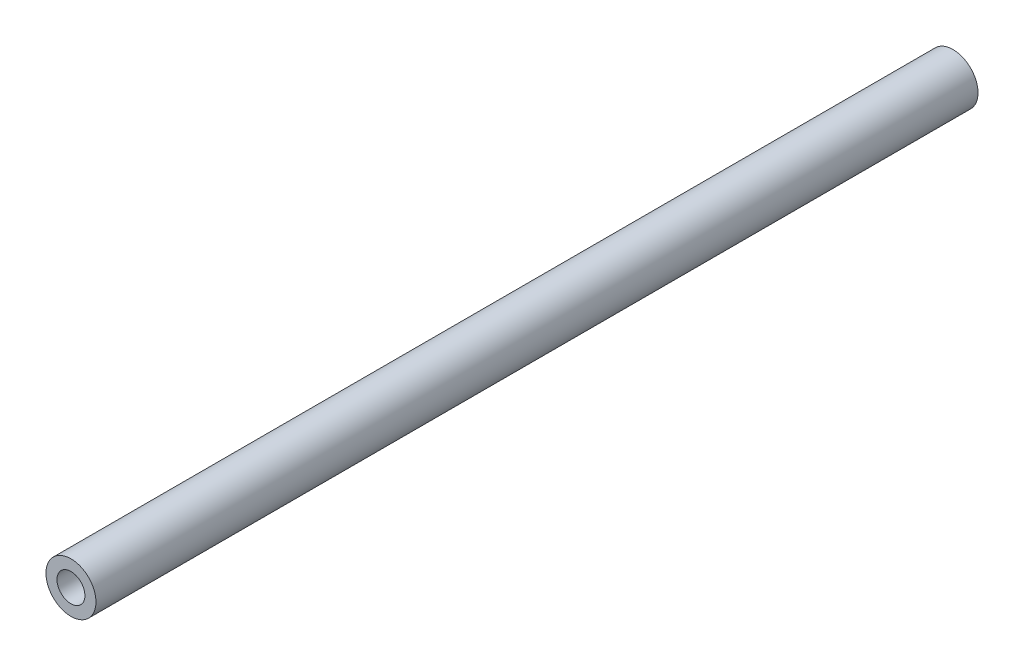
ISO-10303-21;
HEADER;
FILE_DESCRIPTION(('STEP AP214'),'2;1');
FILE_NAME('part.step','',(''),(''),'','','');
FILE_SCHEMA(('AUTOMOTIVE_DESIGN { 1 0 10303 214 1 1 1 1 }'));
ENDSEC;
DATA;
#1=APPLICATION_CONTEXT('core data for automotive mechanical design processes');
#2=APPLICATION_PROTOCOL_DEFINITION('international standard','automotive_design',2000,#1);
#3=PRODUCT_CONTEXT('',#1,'mechanical');
#4=PRODUCT('Part','Part','',(#3));
#5=PRODUCT_RELATED_PRODUCT_CATEGORY('part','',(#4));
#6=PRODUCT_DEFINITION_FORMATION('','',#4);
#7=PRODUCT_DEFINITION_CONTEXT('part definition',#1,'design');
#8=PRODUCT_DEFINITION('design','',#6,#7);
#9=PRODUCT_DEFINITION_SHAPE('','',#8);
#10=(LENGTH_UNIT() NAMED_UNIT(*) SI_UNIT(.MILLI.,.METRE.));
#11=(NAMED_UNIT(*) PLANE_ANGLE_UNIT() SI_UNIT($,.RADIAN.));
#12=(NAMED_UNIT(*) SI_UNIT($,.STERADIAN.) SOLID_ANGLE_UNIT());
#13=UNCERTAINTY_MEASURE_WITH_UNIT(LENGTH_MEASURE(1.E-05),#10,'distance_accuracy_value','');
#14=(GEOMETRIC_REPRESENTATION_CONTEXT(3) GLOBAL_UNCERTAINTY_ASSIGNED_CONTEXT((#13)) GLOBAL_UNIT_ASSIGNED_CONTEXT((#10,
#11,#12)) REPRESENTATION_CONTEXT('',''));
#15=CARTESIAN_POINT('',(0.,0.,0.));
#16=DIRECTION('',(0.,0.,1.));
#17=DIRECTION('',(1.,0.,0.));
#18=AXIS2_PLACEMENT_3D('',#15,#16,#17);
#19=CARTESIAN_POINT('',(0.,0.,300.));
#20=DIRECTION('',(0.,0.,1.));
#21=DIRECTION('',(1.,0.,0.));
#22=AXIS2_PLACEMENT_3D('',#19,#20,#21);
#23=PLANE('',#22);
#24=CARTESIAN_POINT('',(0.,0.,300.));
#25=DIRECTION('',(0.,0.,1.));
#26=DIRECTION('',(1.,0.,0.));
#27=AXIS2_PLACEMENT_3D('',#24,#25,#26);
#28=CIRCLE('',#27,8.5);
#29=CARTESIAN_POINT('',(8.5,0.,300.));
#30=VERTEX_POINT('',#29);
#31=EDGE_CURVE('E10',#30,#30,#28,.T.);
#32=ORIENTED_EDGE('',*,*,#31,.T.);
#33=EDGE_LOOP('',(#32));
#34=FACE_BOUND('',#33,.T.);
#35=CARTESIAN_POINT('',(0.,0.,300.));
#36=DIRECTION('',(0.,0.,1.));
#37=DIRECTION('',(1.,0.,0.));
#38=AXIS2_PLACEMENT_3D('',#35,#36,#37);
#39=CIRCLE('',#38,4.75);
#40=CARTESIAN_POINT('',(4.75,0.,300.));
#41=VERTEX_POINT('',#40);
#42=EDGE_CURVE('E50',#41,#41,#39,.T.);
#43=ORIENTED_EDGE('',*,*,#42,.F.);
#44=EDGE_LOOP('',(#43));
#45=FACE_BOUND('',#44,.T.);
#46=ADVANCED_FACE('F37',(#34,#45),#23,.T.);
#47=CARTESIAN_POINT('',(0.,0.,0.));
#48=DIRECTION('',(0.,0.,1.));
#49=DIRECTION('',(1.,0.,0.));
#50=AXIS2_PLACEMENT_3D('',#47,#48,#49);
#51=PLANE('',#50);
#52=CARTESIAN_POINT('',(0.,0.,0.));
#53=DIRECTION('',(0.,0.,1.));
#54=DIRECTION('',(1.,0.,0.));
#55=AXIS2_PLACEMENT_3D('',#52,#53,#54);
#56=CIRCLE('',#55,8.5);
#57=CARTESIAN_POINT('',(8.5,0.,0.));
#58=VERTEX_POINT('',#57);
#59=EDGE_CURVE('E41',#58,#58,#56,.T.);
#60=ORIENTED_EDGE('',*,*,#59,.F.);
#61=EDGE_LOOP('',(#60));
#62=FACE_BOUND('',#61,.T.);
#63=CARTESIAN_POINT('',(0.,0.,0.));
#64=DIRECTION('',(0.,0.,1.));
#65=DIRECTION('',(1.,0.,0.));
#66=AXIS2_PLACEMENT_3D('',#63,#64,#65);
#67=CIRCLE('',#66,4.75);
#68=CARTESIAN_POINT('',(4.75,0.,0.));
#69=VERTEX_POINT('',#68);
#70=EDGE_CURVE('E52',#69,#69,#67,.T.);
#71=ORIENTED_EDGE('',*,*,#70,.T.);
#72=EDGE_LOOP('',(#71));
#73=FACE_BOUND('',#72,.T.);
#74=ADVANCED_FACE('F64',(#62,#73),#51,.F.);
#75=CARTESIAN_POINT('',(0.,0.,300.));
#76=DIRECTION('',(0.,0.,-1.));
#77=DIRECTION('',(-1.,0.,0.));
#78=AXIS2_PLACEMENT_3D('',#75,#76,#77);
#79=CYLINDRICAL_SURFACE('',#78,8.5);
#80=ORIENTED_EDGE('',*,*,#31,.F.);
#81=EDGE_LOOP('',(#80));
#82=FACE_BOUND('',#81,.T.);
#83=ORIENTED_EDGE('',*,*,#59,.T.);
#84=EDGE_LOOP('',(#83));
#85=FACE_BOUND('',#84,.T.);
#86=ADVANCED_FACE('F39',(#82,#85),#79,.T.);
#87=CARTESIAN_POINT('',(0.,0.,300.));
#88=DIRECTION('',(0.,0.,-1.));
#89=DIRECTION('',(-1.,0.,0.));
#90=AXIS2_PLACEMENT_3D('',#87,#88,#89);
#91=CYLINDRICAL_SURFACE('',#90,4.75);
#92=ORIENTED_EDGE('',*,*,#42,.T.);
#93=EDGE_LOOP('',(#92));
#94=FACE_BOUND('',#93,.T.);
#95=ORIENTED_EDGE('',*,*,#70,.F.);
#96=EDGE_LOOP('',(#95));
#97=FACE_BOUND('',#96,.T.);
#98=ADVANCED_FACE('F60',(#94,#97),#91,.F.);
#99=CLOSED_SHELL('',(#46,#74,#86,#98));
#100=MANIFOLD_SOLID_BREP('B2',#99);
#101=ADVANCED_BREP_SHAPE_REPRESENTATION('',(#18,#100),#14);
#102=SHAPE_DEFINITION_REPRESENTATION(#9,#101);
ENDSEC;
END-ISO-10303-21;
